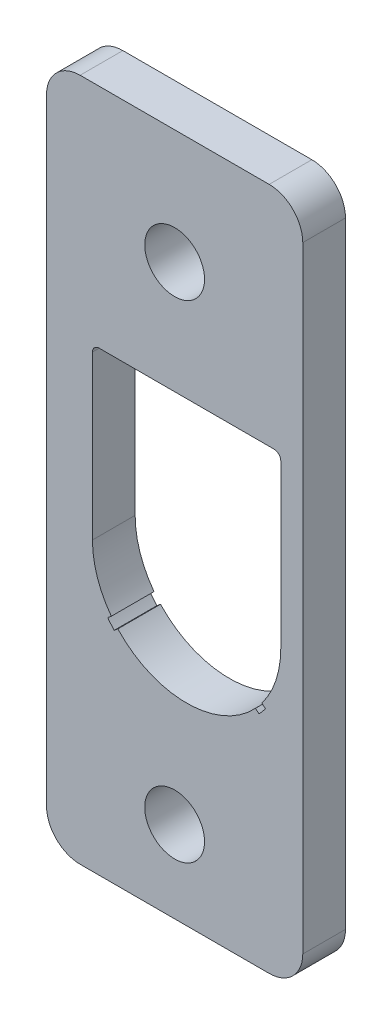
ISO-10303-21;
HEADER;
FILE_DESCRIPTION(('STEP AP214'),'2;1');
FILE_NAME('part.step','',(''),(''),'','','');
FILE_SCHEMA(('AUTOMOTIVE_DESIGN { 1 0 10303 214 1 1 1 1 }'));
ENDSEC;
DATA;
#1=APPLICATION_CONTEXT('core data for automotive mechanical design processes');
#2=APPLICATION_PROTOCOL_DEFINITION('international standard','automotive_design',2000,#1);
#3=PRODUCT_CONTEXT('',#1,'mechanical');
#4=PRODUCT('Part','Part','',(#3));
#5=PRODUCT_RELATED_PRODUCT_CATEGORY('part','',(#4));
#6=PRODUCT_DEFINITION_FORMATION('','',#4);
#7=PRODUCT_DEFINITION_CONTEXT('part definition',#1,'design');
#8=PRODUCT_DEFINITION('design','',#6,#7);
#9=PRODUCT_DEFINITION_SHAPE('','',#8);
#10=(LENGTH_UNIT() NAMED_UNIT(*) SI_UNIT(.MILLI.,.METRE.));
#11=(NAMED_UNIT(*) PLANE_ANGLE_UNIT() SI_UNIT($,.RADIAN.));
#12=(NAMED_UNIT(*) SI_UNIT($,.STERADIAN.) SOLID_ANGLE_UNIT());
#13=UNCERTAINTY_MEASURE_WITH_UNIT(LENGTH_MEASURE(1.E-05),#10,'distance_accuracy_value','');
#14=(GEOMETRIC_REPRESENTATION_CONTEXT(3) GLOBAL_UNCERTAINTY_ASSIGNED_CONTEXT((#13)) GLOBAL_UNIT_ASSIGNED_CONTEXT((#10,
#11,#12)) REPRESENTATION_CONTEXT('',''));
#15=CARTESIAN_POINT('',(0.,0.,0.));
#16=DIRECTION('',(0.,0.,1.));
#17=DIRECTION('',(1.,0.,0.));
#18=AXIS2_PLACEMENT_3D('',#15,#16,#17);
#19=CARTESIAN_POINT('',(-14.05,-172.8,6.35));
#20=DIRECTION('',(0.,0.,-1.));
#21=DIRECTION('',(-1.,0.,0.));
#22=AXIS2_PLACEMENT_3D('',#19,#20,#21);
#23=CYLINDRICAL_SURFACE('',#22,5.);
#24=DIRECTION('',(0.,0.,-1.));
#25=VECTOR('',#24,1.);
#26=CARTESIAN_POINT('',(-14.05,-177.8,6.35));
#27=LINE('',#26,#25);
#28=CARTESIAN_POINT('',(-14.05,-177.8,6.35));
#29=VERTEX_POINT('',#28);
#30=CARTESIAN_POINT('',(-14.05,-177.8,0.));
#31=VERTEX_POINT('',#30);
#32=EDGE_CURVE('E354',#29,#31,#27,.T.);
#33=ORIENTED_EDGE('',*,*,#32,.F.);
#34=CARTESIAN_POINT('',(-14.05,-172.8,6.35));
#35=DIRECTION('',(0.,0.,1.));
#36=DIRECTION('',(1.,0.,0.));
#37=AXIS2_PLACEMENT_3D('',#34,#35,#36);
#38=CIRCLE('',#37,5.);
#39=CARTESIAN_POINT('',(-19.05,-172.8,6.35));
#40=VERTEX_POINT('',#39);
#41=EDGE_CURVE('E42',#40,#29,#38,.T.);
#42=ORIENTED_EDGE('',*,*,#41,.F.);
#43=DIRECTION('',(0.,0.,-1.));
#44=VECTOR('',#43,1.);
#45=CARTESIAN_POINT('',(-19.05,-172.8,6.35));
#46=LINE('',#45,#44);
#47=CARTESIAN_POINT('',(-19.05,-172.8,0.));
#48=VERTEX_POINT('',#47);
#49=EDGE_CURVE('E357',#48,#40,#46,.F.);
#50=ORIENTED_EDGE('',*,*,#49,.F.);
#51=CARTESIAN_POINT('',(-14.05,-172.8,0.));
#52=DIRECTION('',(0.,0.,1.));
#53=DIRECTION('',(1.,0.,0.));
#54=AXIS2_PLACEMENT_3D('',#51,#52,#53);
#55=CIRCLE('',#54,5.);
#56=EDGE_CURVE('E11',#31,#48,#55,.F.);
#57=ORIENTED_EDGE('',*,*,#56,.F.);
#58=EDGE_LOOP('',(#33,#42,#50,#57));
#59=FACE_BOUND('',#58,.T.);
#60=ADVANCED_FACE('F35',(#59),#23,.T.);
#61=CARTESIAN_POINT('',(14.05,-172.8,6.35));
#62=DIRECTION('',(0.,0.,1.));
#63=DIRECTION('',(1.,0.,0.));
#64=AXIS2_PLACEMENT_3D('',#61,#62,#63);
#65=CYLINDRICAL_SURFACE('',#64,5.);
#66=DIRECTION('',(0.,0.,-1.));
#67=VECTOR('',#66,1.);
#68=CARTESIAN_POINT('',(19.05,-172.8,6.35));
#69=LINE('',#68,#67);
#70=CARTESIAN_POINT('',(19.05,-172.8,6.35));
#71=VERTEX_POINT('',#70);
#72=CARTESIAN_POINT('',(19.05,-172.8,0.));
#73=VERTEX_POINT('',#72);
#74=EDGE_CURVE('E344',#71,#73,#69,.T.);
#75=ORIENTED_EDGE('',*,*,#74,.F.);
#76=CARTESIAN_POINT('',(14.05,-172.8,6.35));
#77=DIRECTION('',(0.,0.,1.));
#78=DIRECTION('',(1.,0.,0.));
#79=AXIS2_PLACEMENT_3D('',#76,#77,#78);
#80=CIRCLE('',#79,5.);
#81=CARTESIAN_POINT('',(14.05,-177.8,6.35));
#82=VERTEX_POINT('',#81);
#83=EDGE_CURVE('E350',#82,#71,#80,.T.);
#84=ORIENTED_EDGE('',*,*,#83,.F.);
#85=DIRECTION('',(0.,0.,-1.));
#86=VECTOR('',#85,1.);
#87=CARTESIAN_POINT('',(14.05,-177.8,6.35));
#88=LINE('',#87,#86);
#89=CARTESIAN_POINT('',(14.05,-177.8,0.));
#90=VERTEX_POINT('',#89);
#91=EDGE_CURVE('E347',#90,#82,#88,.F.);
#92=ORIENTED_EDGE('',*,*,#91,.F.);
#93=CARTESIAN_POINT('',(14.05,-172.8,0.));
#94=DIRECTION('',(0.,0.,1.));
#95=DIRECTION('',(1.,0.,0.));
#96=AXIS2_PLACEMENT_3D('',#93,#94,#95);
#97=CIRCLE('',#96,5.);
#98=EDGE_CURVE('E352',#73,#90,#97,.F.);
#99=ORIENTED_EDGE('',*,*,#98,.F.);
#100=EDGE_LOOP('',(#75,#84,#92,#99));
#101=FACE_BOUND('',#100,.T.);
#102=ADVANCED_FACE('F366',(#101),#65,.T.);
#103=CARTESIAN_POINT('',(14.05,-81.1999999999999,6.35));
#104=DIRECTION('',(0.,0.,-1.));
#105=DIRECTION('',(-1.,0.,0.));
#106=AXIS2_PLACEMENT_3D('',#103,#104,#105);
#107=CYLINDRICAL_SURFACE('',#106,5.);
#108=DIRECTION('',(0.,0.,-1.));
#109=VECTOR('',#108,1.);
#110=CARTESIAN_POINT('',(14.05,-76.1999999999999,6.35));
#111=LINE('',#110,#109);
#112=CARTESIAN_POINT('',(14.05,-76.1999999999999,6.35));
#113=VERTEX_POINT('',#112);
#114=CARTESIAN_POINT('',(14.05,-76.1999999999999,0.));
#115=VERTEX_POINT('',#114);
#116=EDGE_CURVE('E333',#113,#115,#111,.T.);
#117=ORIENTED_EDGE('',*,*,#116,.F.);
#118=CARTESIAN_POINT('',(14.05,-81.1999999999999,6.35));
#119=DIRECTION('',(0.,0.,1.));
#120=DIRECTION('',(1.,0.,0.));
#121=AXIS2_PLACEMENT_3D('',#118,#119,#120);
#122=CIRCLE('',#121,5.);
#123=CARTESIAN_POINT('',(19.05,-81.1999999999999,6.35));
#124=VERTEX_POINT('',#123);
#125=EDGE_CURVE('E339',#124,#113,#122,.T.);
#126=ORIENTED_EDGE('',*,*,#125,.F.);
#127=DIRECTION('',(0.,0.,-1.));
#128=VECTOR('',#127,1.);
#129=CARTESIAN_POINT('',(19.05,-81.1999999999999,6.35));
#130=LINE('',#129,#128);
#131=CARTESIAN_POINT('',(19.05,-81.1999999999999,0.));
#132=VERTEX_POINT('',#131);
#133=EDGE_CURVE('E336',#132,#124,#130,.F.);
#134=ORIENTED_EDGE('',*,*,#133,.F.);
#135=CARTESIAN_POINT('',(14.05,-81.1999999999999,0.));
#136=DIRECTION('',(0.,0.,1.));
#137=DIRECTION('',(1.,0.,0.));
#138=AXIS2_PLACEMENT_3D('',#135,#136,#137);
#139=CIRCLE('',#138,5.);
#140=EDGE_CURVE('E341',#115,#132,#139,.F.);
#141=ORIENTED_EDGE('',*,*,#140,.F.);
#142=EDGE_LOOP('',(#117,#126,#134,#141));
#143=FACE_BOUND('',#142,.T.);
#144=ADVANCED_FACE('F373',(#143),#107,.T.);
#145=CARTESIAN_POINT('',(-14.05,-81.2,6.35));
#146=DIRECTION('',(0.,0.,-1.));
#147=DIRECTION('',(-1.,0.,0.));
#148=AXIS2_PLACEMENT_3D('',#145,#146,#147);
#149=CYLINDRICAL_SURFACE('',#148,5.);
#150=DIRECTION('',(0.,0.,1.));
#151=VECTOR('',#150,1.);
#152=CARTESIAN_POINT('',(-14.05,-76.2,6.35));
#153=LINE('',#152,#151);
#154=CARTESIAN_POINT('',(-14.05,-76.2,0.));
#155=VERTEX_POINT('',#154);
#156=CARTESIAN_POINT('',(-14.05,-76.2,6.35));
#157=VERTEX_POINT('',#156);
#158=EDGE_CURVE('E191',#155,#157,#153,.T.);
#159=ORIENTED_EDGE('',*,*,#158,.F.);
#160=CARTESIAN_POINT('',(-14.05,-81.2,0.));
#161=DIRECTION('',(0.,0.,1.));
#162=DIRECTION('',(1.,0.,0.));
#163=AXIS2_PLACEMENT_3D('',#160,#161,#162);
#164=CIRCLE('',#163,5.);
#165=CARTESIAN_POINT('',(-19.05,-81.1999999999999,0.));
#166=VERTEX_POINT('',#165);
#167=EDGE_CURVE('E327',#166,#155,#164,.F.);
#168=ORIENTED_EDGE('',*,*,#167,.F.);
#169=DIRECTION('',(0.,0.,1.));
#170=VECTOR('',#169,1.);
#171=CARTESIAN_POINT('',(-19.05,-81.2,6.35));
#172=LINE('',#171,#170);
#173=CARTESIAN_POINT('',(-19.05,-81.1999999999999,6.35));
#174=VERTEX_POINT('',#173);
#175=EDGE_CURVE('E324',#174,#166,#172,.F.);
#176=ORIENTED_EDGE('',*,*,#175,.F.);
#177=CARTESIAN_POINT('',(-14.05,-81.2,6.35));
#178=DIRECTION('',(0.,0.,1.));
#179=DIRECTION('',(1.,0.,0.));
#180=AXIS2_PLACEMENT_3D('',#177,#178,#179);
#181=CIRCLE('',#180,5.);
#182=EDGE_CURVE('E330',#157,#174,#181,.T.);
#183=ORIENTED_EDGE('',*,*,#182,.F.);
#184=EDGE_LOOP('',(#159,#168,#176,#183));
#185=FACE_BOUND('',#184,.T.);
#186=ADVANCED_FACE('F385',(#185),#149,.T.);
#187=CARTESIAN_POINT('',(-19.0499999999999,0.,6.35));
#188=DIRECTION('',(-1.,0.,0.));
#189=DIRECTION('',(0.,-1.,0.));
#190=AXIS2_PLACEMENT_3D('',#187,#188,#189);
#191=PLANE('',#190);
#192=DIRECTION('',(0.,1.,0.));
#193=VECTOR('',#192,1.);
#194=CARTESIAN_POINT('',(-19.0499999999999,0.,0.));
#195=LINE('',#194,#193);
#196=EDGE_CURVE('E291',#48,#166,#195,.T.);
#197=ORIENTED_EDGE('',*,*,#196,.F.);
#198=ORIENTED_EDGE('',*,*,#49,.T.);
#199=DIRECTION('',(0.,1.,0.));
#200=VECTOR('',#199,1.);
#201=CARTESIAN_POINT('',(-19.0499999999999,0.,6.35));
#202=LINE('',#201,#200);
#203=EDGE_CURVE('E241',#40,#174,#202,.T.);
#204=ORIENTED_EDGE('',*,*,#203,.T.);
#205=ORIENTED_EDGE('',*,*,#175,.T.);
#206=EDGE_LOOP('',(#197,#198,#204,#205));
#207=FACE_BOUND('',#206,.T.);
#208=ADVANCED_FACE('F389',(#207),#191,.T.);
#209=CARTESIAN_POINT('',(0.,-177.8,6.35));
#210=DIRECTION('',(0.,-1.,0.));
#211=DIRECTION('',(0.,0.,-1.));
#212=AXIS2_PLACEMENT_3D('',#209,#210,#211);
#213=PLANE('',#212);
#214=DIRECTION('',(-1.,0.,0.));
#215=VECTOR('',#214,1.);
#216=CARTESIAN_POINT('',(0.,-177.8,6.35));
#217=LINE('',#216,#215);
#218=EDGE_CURVE('E243',#82,#29,#217,.T.);
#219=ORIENTED_EDGE('',*,*,#218,.T.);
#220=ORIENTED_EDGE('',*,*,#32,.T.);
#221=DIRECTION('',(-1.,0.,0.));
#222=VECTOR('',#221,1.);
#223=CARTESIAN_POINT('',(0.,-177.8,0.));
#224=LINE('',#223,#222);
#225=EDGE_CURVE('E293',#90,#31,#224,.T.);
#226=ORIENTED_EDGE('',*,*,#225,.F.);
#227=ORIENTED_EDGE('',*,*,#91,.T.);
#228=EDGE_LOOP('',(#219,#220,#226,#227));
#229=FACE_BOUND('',#228,.T.);
#230=ADVANCED_FACE('F362',(#229),#213,.T.);
#231=CARTESIAN_POINT('',(19.05,0.,6.35));
#232=DIRECTION('',(-1.,0.,0.));
#233=DIRECTION('',(0.,-1.,0.));
#234=AXIS2_PLACEMENT_3D('',#231,#232,#233);
#235=PLANE('',#234);
#236=DIRECTION('',(0.,1.,0.));
#237=VECTOR('',#236,1.);
#238=CARTESIAN_POINT('',(19.05,0.,6.35));
#239=LINE('',#238,#237);
#240=EDGE_CURVE('E246',#71,#124,#239,.T.);
#241=ORIENTED_EDGE('',*,*,#240,.F.);
#242=ORIENTED_EDGE('',*,*,#74,.T.);
#243=DIRECTION('',(0.,1.,0.));
#244=VECTOR('',#243,1.);
#245=CARTESIAN_POINT('',(19.05,0.,0.));
#246=LINE('',#245,#244);
#247=EDGE_CURVE('E295',#73,#132,#246,.T.);
#248=ORIENTED_EDGE('',*,*,#247,.T.);
#249=ORIENTED_EDGE('',*,*,#133,.T.);
#250=EDGE_LOOP('',(#241,#242,#248,#249));
#251=FACE_BOUND('',#250,.T.);
#252=ADVANCED_FACE('F375',(#251),#235,.F.);
#253=CARTESIAN_POINT('',(-11.2220000000001,-110.928,6.35));
#254=DIRECTION('',(0.,0.,-1.));
#255=DIRECTION('',(-1.,0.,0.));
#256=AXIS2_PLACEMENT_3D('',#253,#254,#255);
#257=CYLINDRICAL_SURFACE('',#256,1.);
#258=CARTESIAN_POINT('',(-11.2220000000001,-110.928,0.));
#259=DIRECTION('',(0.,0.,1.));
#260=DIRECTION('',(1.,0.,0.));
#261=AXIS2_PLACEMENT_3D('',#258,#259,#260);
#262=CIRCLE('',#261,1.);
#263=CARTESIAN_POINT('',(-11.2220000000001,-109.928,0.));
#264=VERTEX_POINT('',#263);
#265=CARTESIAN_POINT('',(-12.2220000000001,-110.928,0.));
#266=VERTEX_POINT('',#265);
#267=EDGE_CURVE('E186',#264,#266,#262,.T.);
#268=ORIENTED_EDGE('',*,*,#267,.F.);
#269=DIRECTION('',(0.,0.,-1.));
#270=VECTOR('',#269,1.);
#271=CARTESIAN_POINT('',(-11.2220000000001,-109.928,6.35));
#272=LINE('',#271,#270);
#273=CARTESIAN_POINT('',(-11.2220000000001,-109.928,6.35));
#274=VERTEX_POINT('',#273);
#275=EDGE_CURVE('E180',#274,#264,#272,.T.);
#276=ORIENTED_EDGE('',*,*,#275,.F.);
#277=CARTESIAN_POINT('',(-11.2220000000001,-110.928,6.35));
#278=DIRECTION('',(0.,0.,1.));
#279=DIRECTION('',(1.,0.,0.));
#280=AXIS2_PLACEMENT_3D('',#277,#278,#279);
#281=CIRCLE('',#280,1.);
#282=CARTESIAN_POINT('',(-12.2220000000001,-110.928,6.35));
#283=VERTEX_POINT('',#282);
#284=EDGE_CURVE('E183',#274,#283,#281,.T.);
#285=ORIENTED_EDGE('',*,*,#284,.T.);
#286=DIRECTION('',(0.,0.,-1.));
#287=VECTOR('',#286,1.);
#288=CARTESIAN_POINT('',(-12.2220000000001,-110.928,6.35));
#289=LINE('',#288,#287);
#290=EDGE_CURVE('E250',#283,#266,#289,.T.);
#291=ORIENTED_EDGE('',*,*,#290,.T.);
#292=EDGE_LOOP('',(#268,#276,#285,#291));
#293=FACE_BOUND('',#292,.T.);
#294=ADVANCED_FACE('F182',(#293),#257,.F.);
#295=CARTESIAN_POINT('',(0.,-109.928,6.35));
#296=DIRECTION('',(0.,-1.,0.));
#297=DIRECTION('',(0.,0.,-1.));
#298=AXIS2_PLACEMENT_3D('',#295,#296,#297);
#299=PLANE('',#298);
#300=DIRECTION('',(-1.,0.,0.));
#301=VECTOR('',#300,1.);
#302=CARTESIAN_POINT('',(0.,-109.928,0.));
#303=LINE('',#302,#301);
#304=CARTESIAN_POINT('',(14.7780001797306,-109.928,0.));
#305=VERTEX_POINT('',#304);
#306=EDGE_CURVE('E252',#305,#264,#303,.T.);
#307=ORIENTED_EDGE('',*,*,#306,.F.);
#308=DIRECTION('',(0.,0.,-1.));
#309=VECTOR('',#308,1.);
#310=CARTESIAN_POINT('',(14.7780001797306,-109.928,6.35));
#311=LINE('',#310,#309);
#312=CARTESIAN_POINT('',(14.7780001797306,-109.928,6.35));
#313=VERTEX_POINT('',#312);
#314=EDGE_CURVE('E192',#313,#305,#311,.T.);
#315=ORIENTED_EDGE('',*,*,#314,.F.);
#316=DIRECTION('',(-1.,0.,0.));
#317=VECTOR('',#316,1.);
#318=CARTESIAN_POINT('',(0.,-109.928,6.35));
#319=LINE('',#318,#317);
#320=EDGE_CURVE('E199',#313,#274,#319,.T.);
#321=ORIENTED_EDGE('',*,*,#320,.T.);
#322=ORIENTED_EDGE('',*,*,#275,.T.);
#323=EDGE_LOOP('',(#307,#315,#321,#322));
#324=FACE_BOUND('',#323,.T.);
#325=ADVANCED_FACE('F206',(#324),#299,.T.);
#326=CARTESIAN_POINT('',(14.7780001797306,-110.928,6.35));
#327=DIRECTION('',(0.,0.,-1.));
#328=DIRECTION('',(-1.,0.,0.));
#329=AXIS2_PLACEMENT_3D('',#326,#327,#328);
#330=CYLINDRICAL_SURFACE('',#329,1.);
#331=CARTESIAN_POINT('',(14.7780001797306,-110.928,0.));
#332=DIRECTION('',(0.,0.,1.));
#333=DIRECTION('',(1.,0.,0.));
#334=AXIS2_PLACEMENT_3D('',#331,#332,#333);
#335=CIRCLE('',#334,1.);
#336=CARTESIAN_POINT('',(15.7780001797306,-110.928,0.));
#337=VERTEX_POINT('',#336);
#338=EDGE_CURVE('E255',#337,#305,#335,.T.);
#339=ORIENTED_EDGE('',*,*,#338,.F.);
#340=DIRECTION('',(0.,0.,-1.));
#341=VECTOR('',#340,1.);
#342=CARTESIAN_POINT('',(15.7780001797306,-110.928,6.35));
#343=LINE('',#342,#341);
#344=CARTESIAN_POINT('',(15.7780001797306,-110.928,6.35));
#345=VERTEX_POINT('',#344);
#346=EDGE_CURVE('E319',#345,#337,#343,.T.);
#347=ORIENTED_EDGE('',*,*,#346,.F.);
#348=CARTESIAN_POINT('',(14.7780001797306,-110.928,6.35));
#349=DIRECTION('',(0.,0.,1.));
#350=DIRECTION('',(1.,0.,0.));
#351=AXIS2_PLACEMENT_3D('',#348,#349,#350);
#352=CIRCLE('',#351,1.);
#353=EDGE_CURVE('E207',#345,#313,#352,.T.);
#354=ORIENTED_EDGE('',*,*,#353,.T.);
#355=ORIENTED_EDGE('',*,*,#314,.T.);
#356=EDGE_LOOP('',(#339,#347,#354,#355));
#357=FACE_BOUND('',#356,.T.);
#358=ADVANCED_FACE('F412',(#357),#330,.F.);
#359=CARTESIAN_POINT('',(15.7780001797306,0.,6.35));
#360=DIRECTION('',(-1.,0.,0.));
#361=DIRECTION('',(0.,0.,1.));
#362=AXIS2_PLACEMENT_3D('',#359,#360,#361);
#363=PLANE('',#362);
#364=DIRECTION('',(0.,1.,0.));
#365=VECTOR('',#364,1.);
#366=CARTESIAN_POINT('',(15.7780001797306,0.,0.));
#367=LINE('',#366,#365);
#368=CARTESIAN_POINT('',(15.7780001797306,-135.128,0.));
#369=VERTEX_POINT('',#368);
#370=EDGE_CURVE('E258',#369,#337,#367,.T.);
#371=ORIENTED_EDGE('',*,*,#370,.F.);
#372=DIRECTION('',(0.,0.,-1.));
#373=VECTOR('',#372,1.);
#374=CARTESIAN_POINT('',(15.7780001797306,-135.128,6.35));
#375=LINE('',#374,#373);
#376=CARTESIAN_POINT('',(15.7780001797306,-135.128,6.35));
#377=VERTEX_POINT('',#376);
#378=EDGE_CURVE('E317',#377,#369,#375,.T.);
#379=ORIENTED_EDGE('',*,*,#378,.F.);
#380=DIRECTION('',(0.,1.,0.));
#381=VECTOR('',#380,1.);
#382=CARTESIAN_POINT('',(15.7780001797306,0.,6.35));
#383=LINE('',#382,#381);
#384=EDGE_CURVE('E209',#377,#345,#383,.T.);
#385=ORIENTED_EDGE('',*,*,#384,.T.);
#386=ORIENTED_EDGE('',*,*,#346,.T.);
#387=EDGE_LOOP('',(#371,#379,#385,#386));
#388=FACE_BOUND('',#387,.T.);
#389=ADVANCED_FACE('F415',(#388),#363,.T.);
#390=CARTESIAN_POINT('',(1.77799999999995,-135.128,6.35));
#391=DIRECTION('',(0.,0.,-1.));
#392=DIRECTION('',(-1.,0.,0.));
#393=AXIS2_PLACEMENT_3D('',#390,#391,#392);
#394=CYLINDRICAL_SURFACE('',#393,14.0000001797306);
#395=CARTESIAN_POINT('',(1.77799999999995,-135.128,0.));
#396=DIRECTION('',(0.,0.,1.));
#397=DIRECTION('',(1.,0.,0.));
#398=AXIS2_PLACEMENT_3D('',#395,#396,#397);
#399=CIRCLE('',#398,14.0000001797306);
#400=CARTESIAN_POINT('',(12.9693126549954,-143.539570964487,0.));
#401=VERTEX_POINT('',#400);
#402=EDGE_CURVE('E261',#401,#369,#399,.T.);
#403=ORIENTED_EDGE('',*,*,#402,.F.);
#404=DIRECTION('',(0.,0.,-1.));
#405=VECTOR('',#404,1.);
#406=CARTESIAN_POINT('',(12.9693126549954,-143.539570964487,6.35));
#407=LINE('',#406,#405);
#408=CARTESIAN_POINT('',(12.9693126549954,-143.539570964487,6.35));
#409=VERTEX_POINT('',#408);
#410=EDGE_CURVE('E315',#409,#401,#407,.T.);
#411=ORIENTED_EDGE('',*,*,#410,.F.);
#412=CARTESIAN_POINT('',(1.77799999999995,-135.128,6.35));
#413=DIRECTION('',(0.,0.,1.));
#414=DIRECTION('',(1.,0.,0.));
#415=AXIS2_PLACEMENT_3D('',#412,#413,#414);
#416=CIRCLE('',#415,14.0000001797306);
#417=EDGE_CURVE('E215',#409,#377,#416,.T.);
#418=ORIENTED_EDGE('',*,*,#417,.T.);
#419=ORIENTED_EDGE('',*,*,#378,.T.);
#420=EDGE_LOOP('',(#403,#411,#418,#419));
#421=FACE_BOUND('',#420,.T.);
#422=ADVANCED_FACE('F419',(#421),#394,.F.);
#423=CARTESIAN_POINT('',(-65.3208337904808,-77.8463358827502,6.35));
#424=DIRECTION('',(0.642787621598217,0.766044433123894,0.));
#425=DIRECTION('',(-0.766044433123894,0.642787621598217,0.));
#426=AXIS2_PLACEMENT_3D('',#423,#424,#425);
#427=PLANE('',#426);
#428=DIRECTION('',(0.766044433123894,-0.642787621598217,0.));
#429=VECTOR('',#428,1.);
#430=CARTESIAN_POINT('',(-65.3208337904808,-77.8463358827502,0.));
#431=LINE('',#430,#429);
#432=CARTESIAN_POINT('',(13.5062779508305,-143.990138360406,0.));
#433=VERTEX_POINT('',#432);
#434=EDGE_CURVE('E264',#401,#433,#431,.T.);
#435=ORIENTED_EDGE('',*,*,#434,.T.);
#436=DIRECTION('',(0.,0.,-1.));
#437=VECTOR('',#436,1.);
#438=CARTESIAN_POINT('',(13.5062779508305,-143.990138360406,6.35));
#439=LINE('',#438,#437);
#440=CARTESIAN_POINT('',(13.5062779508305,-143.990138360406,6.35));
#441=VERTEX_POINT('',#440);
#442=EDGE_CURVE('E313',#441,#433,#439,.T.);
#443=ORIENTED_EDGE('',*,*,#442,.F.);
#444=DIRECTION('',(0.766044433123894,-0.642787621598217,0.));
#445=VECTOR('',#444,1.);
#446=CARTESIAN_POINT('',(-65.3208337904808,-77.8463358827502,6.35));
#447=LINE('',#446,#445);
#448=EDGE_CURVE('E218',#409,#441,#447,.T.);
#449=ORIENTED_EDGE('',*,*,#448,.F.);
#450=ORIENTED_EDGE('',*,*,#410,.T.);
#451=EDGE_LOOP('',(#435,#443,#449,#450));
#452=FACE_BOUND('',#451,.T.);
#453=ADVANCED_FACE('F423',(#452),#427,.F.);
#454=CARTESIAN_POINT('',(1.77799999999995,-135.128,6.35));
#455=DIRECTION('',(0.,0.,-1.));
#456=DIRECTION('',(-1.,0.,0.));
#457=AXIS2_PLACEMENT_3D('',#454,#455,#456);
#458=CYLINDRICAL_SURFACE('',#457,14.700000000371);
#459=CARTESIAN_POINT('',(1.77799999999995,-135.128,0.));
#460=DIRECTION('',(0.,0.,1.));
#461=DIRECTION('',(1.,0.,0.));
#462=AXIS2_PLACEMENT_3D('',#459,#460,#461);
#463=CIRCLE('',#462,14.700000000371);
#464=CARTESIAN_POINT('',(12.5420965259673,-145.139205021903,0.));
#465=VERTEX_POINT('',#464);
#466=EDGE_CURVE('E267',#465,#433,#463,.T.);
#467=ORIENTED_EDGE('',*,*,#466,.F.);
#468=DIRECTION('',(0.,0.,-1.));
#469=VECTOR('',#468,1.);
#470=CARTESIAN_POINT('',(12.5420965259673,-145.139205021903,6.35));
#471=LINE('',#470,#469);
#472=CARTESIAN_POINT('',(12.5420965259673,-145.139205021903,6.35));
#473=VERTEX_POINT('',#472);
#474=EDGE_CURVE('E311',#473,#465,#471,.T.);
#475=ORIENTED_EDGE('',*,*,#474,.F.);
#476=CARTESIAN_POINT('',(1.77799999999995,-135.128,6.35));
#477=DIRECTION('',(0.,0.,1.));
#478=DIRECTION('',(1.,0.,0.));
#479=AXIS2_PLACEMENT_3D('',#476,#477,#478);
#480=CIRCLE('',#479,14.700000000371);
#481=EDGE_CURVE('E220',#473,#441,#480,.T.);
#482=ORIENTED_EDGE('',*,*,#481,.T.);
#483=ORIENTED_EDGE('',*,*,#442,.T.);
#484=EDGE_LOOP('',(#467,#475,#482,#483));
#485=FACE_BOUND('',#484,.T.);
#486=ADVANCED_FACE('F427',(#485),#458,.F.);
#487=CARTESIAN_POINT('',(-66.285011919312,-78.9954398678438,6.35));
#488=DIRECTION('',(0.642787424522218,0.766044598490254,0.));
#489=DIRECTION('',(-0.766044598490254,0.642787424522218,0.));
#490=AXIS2_PLACEMENT_3D('',#487,#488,#489);
#491=PLANE('',#490);
#492=DIRECTION('',(0.766044598490254,-0.642787424522218,0.));
#493=VECTOR('',#492,1.);
#494=CARTESIAN_POINT('',(-66.285011919312,-78.9954398678438,0.));
#495=LINE('',#494,#493);
#496=CARTESIAN_POINT('',(12.0051309708954,-144.688637643865,0.));
#497=VERTEX_POINT('',#496);
#498=EDGE_CURVE('E270',#497,#465,#495,.T.);
#499=ORIENTED_EDGE('',*,*,#498,.F.);
#500=DIRECTION('',(0.,0.,-1.));
#501=VECTOR('',#500,1.);
#502=CARTESIAN_POINT('',(12.0051309708954,-144.688637643865,6.35));
#503=LINE('',#502,#501);
#504=CARTESIAN_POINT('',(12.0051309708954,-144.688637643865,6.35));
#505=VERTEX_POINT('',#504);
#506=EDGE_CURVE('E309',#505,#497,#503,.T.);
#507=ORIENTED_EDGE('',*,*,#506,.F.);
#508=DIRECTION('',(0.766044598490254,-0.642787424522218,0.));
#509=VECTOR('',#508,1.);
#510=CARTESIAN_POINT('',(-66.285011919312,-78.9954398678438,6.35));
#511=LINE('',#510,#509);
#512=EDGE_CURVE('E223',#505,#473,#511,.T.);
#513=ORIENTED_EDGE('',*,*,#512,.T.);
#514=ORIENTED_EDGE('',*,*,#474,.T.);
#515=EDGE_LOOP('',(#499,#507,#513,#514));
#516=FACE_BOUND('',#515,.T.);
#517=ADVANCED_FACE('F431',(#516),#491,.T.);
#518=CARTESIAN_POINT('',(1.77799999999995,-135.128,6.35));
#519=DIRECTION('',(0.,0.,-1.));
#520=DIRECTION('',(-1.,0.,0.));
#521=AXIS2_PLACEMENT_3D('',#518,#519,#520);
#522=CYLINDRICAL_SURFACE('',#521,14.0000000018974);
#523=CARTESIAN_POINT('',(1.77799999999995,-135.128,0.));
#524=DIRECTION('',(0.,0.,1.));
#525=DIRECTION('',(1.,0.,0.));
#526=AXIS2_PLACEMENT_3D('',#523,#524,#525);
#527=CIRCLE('',#526,14.0000000018974);
#528=CARTESIAN_POINT('',(-8.44913123975992,-144.688637356257,0.));
#529=VERTEX_POINT('',#528);
#530=EDGE_CURVE('E273',#529,#497,#527,.T.);
#531=ORIENTED_EDGE('',*,*,#530,.F.);
#532=DIRECTION('',(0.,0.,-1.));
#533=VECTOR('',#532,1.);
#534=CARTESIAN_POINT('',(-8.44913123975992,-144.688637356257,6.35));
#535=LINE('',#534,#533);
#536=CARTESIAN_POINT('',(-8.44913123975992,-144.688637356257,6.35));
#537=VERTEX_POINT('',#536);
#538=EDGE_CURVE('E307',#537,#529,#535,.T.);
#539=ORIENTED_EDGE('',*,*,#538,.F.);
#540=CARTESIAN_POINT('',(1.77799999999995,-135.128,6.35));
#541=DIRECTION('',(0.,0.,1.));
#542=DIRECTION('',(1.,0.,0.));
#543=AXIS2_PLACEMENT_3D('',#540,#541,#542);
#544=CIRCLE('',#543,14.0000000018974);
#545=EDGE_CURVE('E226',#537,#505,#544,.T.);
#546=ORIENTED_EDGE('',*,*,#545,.T.);
#547=ORIENTED_EDGE('',*,*,#506,.T.);
#548=EDGE_LOOP('',(#531,#539,#546,#547));
#549=FACE_BOUND('',#548,.T.);
#550=ADVANCED_FACE('F435',(#549),#522,.F.);
#551=CARTESIAN_POINT('',(67.754268432269,-80.7463927180608,6.35));
#552=DIRECTION('',(0.642787610152228,-0.766044442728219,0.));
#553=DIRECTION('',(0.766044442728219,0.642787610152228,0.));
#554=AXIS2_PLACEMENT_3D('',#551,#552,#553);
#555=PLANE('',#554);
#556=DIRECTION('',(-0.766044442728219,-0.642787610152228,0.));
#557=VECTOR('',#556,1.);
#558=CARTESIAN_POINT('',(67.754268432269,-80.7463927180608,0.));
#559=LINE('',#558,#557);
#560=CARTESIAN_POINT('',(-8.98609667794231,-145.139204857947,0.));
#561=VERTEX_POINT('',#560);
#562=EDGE_CURVE('E276',#529,#561,#559,.T.);
#563=ORIENTED_EDGE('',*,*,#562,.T.);
#564=DIRECTION('',(0.,0.,-1.));
#565=VECTOR('',#564,1.);
#566=CARTESIAN_POINT('',(-8.98609667794231,-145.139204857947,6.35));
#567=LINE('',#566,#565);
#568=CARTESIAN_POINT('',(-8.98609667794231,-145.139204857947,6.35));
#569=VERTEX_POINT('',#568);
#570=EDGE_CURVE('E305',#569,#561,#567,.T.);
#571=ORIENTED_EDGE('',*,*,#570,.F.);
#572=DIRECTION('',(-0.766044442728219,-0.642787610152228,0.));
#573=VECTOR('',#572,1.);
#574=CARTESIAN_POINT('',(67.754268432269,-80.7463927180608,6.35));
#575=LINE('',#574,#573);
#576=EDGE_CURVE('E229',#537,#569,#575,.T.);
#577=ORIENTED_EDGE('',*,*,#576,.F.);
#578=ORIENTED_EDGE('',*,*,#538,.T.);
#579=EDGE_LOOP('',(#563,#571,#577,#578));
#580=FACE_BOUND('',#579,.T.);
#581=ADVANCED_FACE('F439',(#580),#555,.F.);
#582=CARTESIAN_POINT('',(1.77799999999995,-135.128,6.35));
#583=DIRECTION('',(0.,0.,-1.));
#584=DIRECTION('',(-1.,0.,0.));
#585=AXIS2_PLACEMENT_3D('',#582,#583,#584);
#586=CYLINDRICAL_SURFACE('',#585,14.6999999999956);
#587=CARTESIAN_POINT('',(1.77799999999995,-135.128,0.));
#588=DIRECTION('',(0.,0.,1.));
#589=DIRECTION('',(1.,0.,0.));
#590=AXIS2_PLACEMENT_3D('',#587,#588,#589);
#591=CIRCLE('',#590,14.6999999999956);
#592=CARTESIAN_POINT('',(-9.95027794992218,-143.990138360985,0.));
#593=VERTEX_POINT('',#592);
#594=EDGE_CURVE('E279',#593,#561,#591,.T.);
#595=ORIENTED_EDGE('',*,*,#594,.F.);
#596=DIRECTION('',(0.,0.,-1.));
#597=VECTOR('',#596,1.);
#598=CARTESIAN_POINT('',(-9.95027794992218,-143.990138360985,6.35));
#599=LINE('',#598,#597);
#600=CARTESIAN_POINT('',(-9.95027794992218,-143.990138360985,6.35));
#601=VERTEX_POINT('',#600);
#602=EDGE_CURVE('E303',#601,#593,#599,.T.);
#603=ORIENTED_EDGE('',*,*,#602,.F.);
#604=CARTESIAN_POINT('',(1.77799999999995,-135.128,6.35));
#605=DIRECTION('',(0.,0.,1.));
#606=DIRECTION('',(1.,0.,0.));
#607=AXIS2_PLACEMENT_3D('',#604,#605,#606);
#608=CIRCLE('',#607,14.6999999999956);
#609=EDGE_CURVE('E231',#601,#569,#608,.T.);
#610=ORIENTED_EDGE('',*,*,#609,.T.);
#611=ORIENTED_EDGE('',*,*,#570,.T.);
#612=EDGE_LOOP('',(#595,#603,#610,#611));
#613=FACE_BOUND('',#612,.T.);
#614=ADVANCED_FACE('F443',(#613),#586,.F.);
#615=CARTESIAN_POINT('',(66.790088144257,-79.5973169172563,6.35));
#616=DIRECTION('',(0.642787659816196,-0.766044401055199,0.));
#617=DIRECTION('',(0.766044401055199,0.642787659816196,0.));
#618=AXIS2_PLACEMENT_3D('',#615,#616,#617);
#619=PLANE('',#618);
#620=DIRECTION('',(-0.766044401055199,-0.642787659816196,0.));
#621=VECTOR('',#620,1.);
#622=CARTESIAN_POINT('',(66.790088144257,-79.5973169172563,0.));
#623=LINE('',#622,#621);
#624=CARTESIAN_POINT('',(-9.41331253753903,-143.53957082162,0.));
#625=VERTEX_POINT('',#624);
#626=EDGE_CURVE('E282',#625,#593,#623,.T.);
#627=ORIENTED_EDGE('',*,*,#626,.F.);
#628=DIRECTION('',(0.,0.,-1.));
#629=VECTOR('',#628,1.);
#630=CARTESIAN_POINT('',(-9.41331253753903,-143.53957082162,6.35));
#631=LINE('',#630,#629);
#632=CARTESIAN_POINT('',(-9.41331253753903,-143.53957082162,6.35));
#633=VERTEX_POINT('',#632);
#634=EDGE_CURVE('E301',#633,#625,#631,.T.);
#635=ORIENTED_EDGE('',*,*,#634,.F.);
#636=DIRECTION('',(-0.766044401055199,-0.642787659816196,0.));
#637=VECTOR('',#636,1.);
#638=CARTESIAN_POINT('',(66.790088144257,-79.5973169172563,6.35));
#639=LINE('',#638,#637);
#640=EDGE_CURVE('E234',#633,#601,#639,.T.);
#641=ORIENTED_EDGE('',*,*,#640,.T.);
#642=ORIENTED_EDGE('',*,*,#602,.T.);
#643=EDGE_LOOP('',(#627,#635,#641,#642));
#644=FACE_BOUND('',#643,.T.);
#645=ADVANCED_FACE('F447',(#644),#619,.T.);
#646=CARTESIAN_POINT('',(1.77799999999995,-135.128,6.35));
#647=DIRECTION('',(0.,0.,-1.));
#648=DIRECTION('',(-1.,0.,0.));
#649=AXIS2_PLACEMENT_3D('',#646,#647,#648);
#650=CYLINDRICAL_SURFACE('',#649,14.);
#651=CARTESIAN_POINT('',(1.77799999999995,-135.128,0.));
#652=DIRECTION('',(0.,0.,1.));
#653=DIRECTION('',(1.,0.,0.));
#654=AXIS2_PLACEMENT_3D('',#651,#652,#653);
#655=CIRCLE('',#654,14.);
#656=CARTESIAN_POINT('',(-12.2220000000001,-135.128,0.));
#657=VERTEX_POINT('',#656);
#658=EDGE_CURVE('E285',#657,#625,#655,.T.);
#659=ORIENTED_EDGE('',*,*,#658,.F.);
#660=DIRECTION('',(0.,0.,-1.));
#661=VECTOR('',#660,1.);
#662=CARTESIAN_POINT('',(-12.2220000000001,-135.128,6.35));
#663=LINE('',#662,#661);
#664=CARTESIAN_POINT('',(-12.2220000000001,-135.128,6.35));
#665=VERTEX_POINT('',#664);
#666=EDGE_CURVE('E299',#665,#657,#663,.T.);
#667=ORIENTED_EDGE('',*,*,#666,.F.);
#668=CARTESIAN_POINT('',(1.77799999999995,-135.128,6.35));
#669=DIRECTION('',(0.,0.,1.));
#670=DIRECTION('',(1.,0.,0.));
#671=AXIS2_PLACEMENT_3D('',#668,#669,#670);
#672=CIRCLE('',#671,14.);
#673=EDGE_CURVE('E237',#665,#633,#672,.T.);
#674=ORIENTED_EDGE('',*,*,#673,.T.);
#675=ORIENTED_EDGE('',*,*,#634,.T.);
#676=EDGE_LOOP('',(#659,#667,#674,#675));
#677=FACE_BOUND('',#676,.T.);
#678=ADVANCED_FACE('F451',(#677),#650,.F.);
#679=CARTESIAN_POINT('',(-12.2220000000001,0.,6.35));
#680=DIRECTION('',(1.,0.,0.));
#681=DIRECTION('',(0.,0.,-1.));
#682=AXIS2_PLACEMENT_3D('',#679,#680,#681);
#683=PLANE('',#682);
#684=DIRECTION('',(0.,-1.,0.));
#685=VECTOR('',#684,1.);
#686=CARTESIAN_POINT('',(-12.2220000000001,0.,0.));
#687=LINE('',#686,#685);
#688=EDGE_CURVE('E288',#266,#657,#687,.T.);
#689=ORIENTED_EDGE('',*,*,#688,.F.);
#690=ORIENTED_EDGE('',*,*,#290,.F.);
#691=DIRECTION('',(0.,-1.,0.));
#692=VECTOR('',#691,1.);
#693=CARTESIAN_POINT('',(-12.2220000000001,0.,6.35));
#694=LINE('',#693,#692);
#695=EDGE_CURVE('E203',#283,#665,#694,.T.);
#696=ORIENTED_EDGE('',*,*,#695,.T.);
#697=ORIENTED_EDGE('',*,*,#666,.T.);
#698=EDGE_LOOP('',(#689,#690,#696,#697));
#699=FACE_BOUND('',#698,.T.);
#700=ADVANCED_FACE('F454',(#699),#683,.T.);
#701=CARTESIAN_POINT('',(0.,-76.1999999999999,6.35));
#702=DIRECTION('',(0.,-1.,0.));
#703=DIRECTION('',(1.,0.,0.));
#704=AXIS2_PLACEMENT_3D('',#701,#702,#703);
#705=PLANE('',#704);
#706=DIRECTION('',(-1.,0.,0.));
#707=VECTOR('',#706,1.);
#708=CARTESIAN_POINT('',(0.,-76.1999999999999,6.35));
#709=LINE('',#708,#707);
#710=EDGE_CURVE('E248',#113,#157,#709,.T.);
#711=ORIENTED_EDGE('',*,*,#710,.F.);
#712=ORIENTED_EDGE('',*,*,#116,.T.);
#713=DIRECTION('',(-1.,0.,0.));
#714=VECTOR('',#713,1.);
#715=CARTESIAN_POINT('',(0.,-76.1999999999999,0.));
#716=LINE('',#715,#714);
#717=EDGE_CURVE('E204',#115,#155,#716,.T.);
#718=ORIENTED_EDGE('',*,*,#717,.T.);
#719=ORIENTED_EDGE('',*,*,#158,.T.);
#720=EDGE_LOOP('',(#711,#712,#718,#719));
#721=FACE_BOUND('',#720,.T.);
#722=ADVANCED_FACE('F380',(#721),#705,.F.);
#723=CARTESIAN_POINT('',(0.,0.,6.35));
#724=DIRECTION('',(0.,0.,1.));
#725=DIRECTION('',(1.,0.,0.));
#726=AXIS2_PLACEMENT_3D('',#723,#724,#725);
#727=PLANE('',#726);
#728=CARTESIAN_POINT('',(0.,-165.643685175467,6.35));
#729=DIRECTION('',(0.,0.,1.));
#730=DIRECTION('',(1.,0.,0.));
#731=AXIS2_PLACEMENT_3D('',#728,#729,#730);
#732=CIRCLE('',#731,4.445);
#733=CARTESIAN_POINT('',(4.445,-165.643685175467,6.35));
#734=VERTEX_POINT('',#733);
#735=EDGE_CURVE('E613',#734,#734,#732,.T.);
#736=ORIENTED_EDGE('',*,*,#735,.F.);
#737=EDGE_LOOP('',(#736));
#738=FACE_BOUND('',#737,.T.);
#739=CARTESIAN_POINT('',(0.,-93.2343894146995,6.35));
#740=DIRECTION('',(0.,0.,1.));
#741=DIRECTION('',(1.,0.,0.));
#742=AXIS2_PLACEMENT_3D('',#739,#740,#741);
#743=CIRCLE('',#742,4.445);
#744=CARTESIAN_POINT('',(4.445,-93.2343894146995,6.35));
#745=VERTEX_POINT('',#744);
#746=EDGE_CURVE('E616',#745,#745,#743,.T.);
#747=ORIENTED_EDGE('',*,*,#746,.F.);
#748=EDGE_LOOP('',(#747));
#749=FACE_BOUND('',#748,.T.);
#750=ORIENTED_EDGE('',*,*,#284,.F.);
#751=ORIENTED_EDGE('',*,*,#320,.F.);
#752=ORIENTED_EDGE('',*,*,#353,.F.);
#753=ORIENTED_EDGE('',*,*,#384,.F.);
#754=ORIENTED_EDGE('',*,*,#417,.F.);
#755=ORIENTED_EDGE('',*,*,#448,.T.);
#756=ORIENTED_EDGE('',*,*,#481,.F.);
#757=ORIENTED_EDGE('',*,*,#512,.F.);
#758=ORIENTED_EDGE('',*,*,#545,.F.);
#759=ORIENTED_EDGE('',*,*,#576,.T.);
#760=ORIENTED_EDGE('',*,*,#609,.F.);
#761=ORIENTED_EDGE('',*,*,#640,.F.);
#762=ORIENTED_EDGE('',*,*,#673,.F.);
#763=ORIENTED_EDGE('',*,*,#695,.F.);
#764=EDGE_LOOP('',(#750,#751,#752,#753,#754,#755,#756,#757,#758,#759,#760,#761,#762,#763));
#765=FACE_BOUND('',#764,.T.);
#766=ORIENTED_EDGE('',*,*,#203,.F.);
#767=ORIENTED_EDGE('',*,*,#41,.T.);
#768=ORIENTED_EDGE('',*,*,#218,.F.);
#769=ORIENTED_EDGE('',*,*,#83,.T.);
#770=ORIENTED_EDGE('',*,*,#240,.T.);
#771=ORIENTED_EDGE('',*,*,#125,.T.);
#772=ORIENTED_EDGE('',*,*,#710,.T.);
#773=ORIENTED_EDGE('',*,*,#182,.T.);
#774=EDGE_LOOP('',(#766,#767,#768,#769,#770,#771,#772,#773));
#775=FACE_BOUND('',#774,.T.);
#776=ADVANCED_FACE('F196',(#738,#749,#765,#775),#727,.T.);
#777=CARTESIAN_POINT('',(0.,0.,0.));
#778=DIRECTION('',(0.,0.,1.));
#779=DIRECTION('',(1.,0.,0.));
#780=AXIS2_PLACEMENT_3D('',#777,#778,#779);
#781=PLANE('',#780);
#782=CARTESIAN_POINT('',(0.,-165.643685175467,0.));
#783=DIRECTION('',(0.,0.,1.));
#784=DIRECTION('',(1.,0.,0.));
#785=AXIS2_PLACEMENT_3D('',#782,#783,#784);
#786=CIRCLE('',#785,4.445);
#787=CARTESIAN_POINT('',(4.445,-165.643685175467,0.));
#788=VERTEX_POINT('',#787);
#789=EDGE_CURVE('E615',#788,#788,#786,.F.);
#790=ORIENTED_EDGE('',*,*,#789,.F.);
#791=EDGE_LOOP('',(#790));
#792=FACE_BOUND('',#791,.T.);
#793=CARTESIAN_POINT('',(0.,-93.2343894146995,0.));
#794=DIRECTION('',(0.,0.,1.));
#795=DIRECTION('',(1.,0.,0.));
#796=AXIS2_PLACEMENT_3D('',#793,#794,#795);
#797=CIRCLE('',#796,4.445);
#798=CARTESIAN_POINT('',(4.445,-93.2343894146995,0.));
#799=VERTEX_POINT('',#798);
#800=EDGE_CURVE('E253',#799,#799,#797,.F.);
#801=ORIENTED_EDGE('',*,*,#800,.F.);
#802=EDGE_LOOP('',(#801));
#803=FACE_BOUND('',#802,.T.);
#804=ORIENTED_EDGE('',*,*,#267,.T.);
#805=ORIENTED_EDGE('',*,*,#688,.T.);
#806=ORIENTED_EDGE('',*,*,#658,.T.);
#807=ORIENTED_EDGE('',*,*,#626,.T.);
#808=ORIENTED_EDGE('',*,*,#594,.T.);
#809=ORIENTED_EDGE('',*,*,#562,.F.);
#810=ORIENTED_EDGE('',*,*,#530,.T.);
#811=ORIENTED_EDGE('',*,*,#498,.T.);
#812=ORIENTED_EDGE('',*,*,#466,.T.);
#813=ORIENTED_EDGE('',*,*,#434,.F.);
#814=ORIENTED_EDGE('',*,*,#402,.T.);
#815=ORIENTED_EDGE('',*,*,#370,.T.);
#816=ORIENTED_EDGE('',*,*,#338,.T.);
#817=ORIENTED_EDGE('',*,*,#306,.T.);
#818=EDGE_LOOP('',(#804,#805,#806,#807,#808,#809,#810,#811,#812,#813,#814,#815,#816,#817));
#819=FACE_BOUND('',#818,.T.);
#820=ORIENTED_EDGE('',*,*,#225,.T.);
#821=ORIENTED_EDGE('',*,*,#56,.T.);
#822=ORIENTED_EDGE('',*,*,#196,.T.);
#823=ORIENTED_EDGE('',*,*,#167,.T.);
#824=ORIENTED_EDGE('',*,*,#717,.F.);
#825=ORIENTED_EDGE('',*,*,#140,.T.);
#826=ORIENTED_EDGE('',*,*,#247,.F.);
#827=ORIENTED_EDGE('',*,*,#98,.T.);
#828=EDGE_LOOP('',(#820,#821,#822,#823,#824,#825,#826,#827));
#829=FACE_BOUND('',#828,.T.);
#830=ADVANCED_FACE('F378',(#792,#803,#819,#829),#781,.F.);
#831=CARTESIAN_POINT('',(0.,-93.2343894146995,-0.00100000000000013));
#832=DIRECTION('',(0.,0.,1.));
#833=DIRECTION('',(1.,0.,0.));
#834=AXIS2_PLACEMENT_3D('',#831,#832,#833);
#835=CYLINDRICAL_SURFACE('',#834,4.445);
#836=ORIENTED_EDGE('',*,*,#746,.T.);
#837=EDGE_LOOP('',(#836));
#838=FACE_BOUND('',#837,.T.);
#839=ORIENTED_EDGE('',*,*,#800,.T.);
#840=EDGE_LOOP('',(#839));
#841=FACE_BOUND('',#840,.T.);
#842=ADVANCED_FACE('F487',(#838,#841),#835,.F.);
#843=CARTESIAN_POINT('',(0.,-165.643685175467,-0.00100000000000013));
#844=DIRECTION('',(0.,0.,1.));
#845=DIRECTION('',(1.,0.,0.));
#846=AXIS2_PLACEMENT_3D('',#843,#844,#845);
#847=CYLINDRICAL_SURFACE('',#846,4.445);
#848=ORIENTED_EDGE('',*,*,#735,.T.);
#849=EDGE_LOOP('',(#848));
#850=FACE_BOUND('',#849,.T.);
#851=ORIENTED_EDGE('',*,*,#789,.T.);
#852=EDGE_LOOP('',(#851));
#853=FACE_BOUND('',#852,.T.);
#854=ADVANCED_FACE('F494',(#850,#853),#847,.F.);
#855=CLOSED_SHELL('',(#60,#102,#144,#186,#208,#230,#252,#294,#325,#358,#389,#422,#453,#486,#517,
#550,#581,#614,#645,#678,#700,#722,#776,#830,#842,#854));
#856=MANIFOLD_SOLID_BREP('B2',#855);
#857=ADVANCED_BREP_SHAPE_REPRESENTATION('',(#18,#856),#14);
#858=SHAPE_DEFINITION_REPRESENTATION(#9,#857);
ENDSEC;
END-ISO-10303-21;
